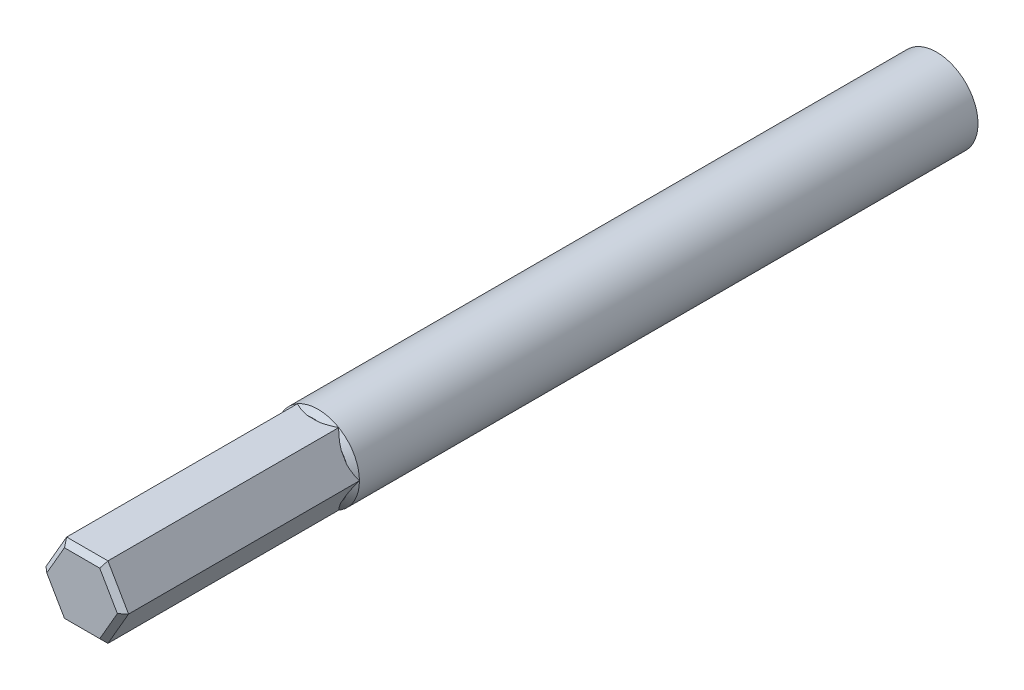
ISO-10303-21;
HEADER;
FILE_DESCRIPTION(('STEP AP214'),'2;1');
FILE_NAME('part.step','',(''),(''),'','','');
FILE_SCHEMA(('AUTOMOTIVE_DESIGN { 1 0 10303 214 1 1 1 1 }'));
ENDSEC;
DATA;
#1=APPLICATION_CONTEXT('core data for automotive mechanical design processes');
#2=APPLICATION_PROTOCOL_DEFINITION('international standard','automotive_design',2000,#1);
#3=PRODUCT_CONTEXT('',#1,'mechanical');
#4=PRODUCT('Part','Part','',(#3));
#5=PRODUCT_RELATED_PRODUCT_CATEGORY('part','',(#4));
#6=PRODUCT_DEFINITION_FORMATION('','',#4);
#7=PRODUCT_DEFINITION_CONTEXT('part definition',#1,'design');
#8=PRODUCT_DEFINITION('design','',#6,#7);
#9=PRODUCT_DEFINITION_SHAPE('','',#8);
#10=(LENGTH_UNIT() NAMED_UNIT(*) SI_UNIT(.MILLI.,.METRE.));
#11=(NAMED_UNIT(*) PLANE_ANGLE_UNIT() SI_UNIT($,.RADIAN.));
#12=(NAMED_UNIT(*) SI_UNIT($,.STERADIAN.) SOLID_ANGLE_UNIT());
#13=UNCERTAINTY_MEASURE_WITH_UNIT(LENGTH_MEASURE(1.E-05),#10,'distance_accuracy_value','');
#14=(GEOMETRIC_REPRESENTATION_CONTEXT(3) GLOBAL_UNCERTAINTY_ASSIGNED_CONTEXT((#13)) GLOBAL_UNIT_ASSIGNED_CONTEXT((#10,
#11,#12)) REPRESENTATION_CONTEXT('',''));
#15=CARTESIAN_POINT('',(0.,0.,0.));
#16=DIRECTION('',(0.,0.,1.));
#17=DIRECTION('',(1.,0.,0.));
#18=AXIS2_PLACEMENT_3D('',#15,#16,#17);
#19=CARTESIAN_POINT('',(0.,0.,60.));
#20=DIRECTION('',(0.,0.,1.));
#21=DIRECTION('',(1.,0.,0.));
#22=AXIS2_PLACEMENT_3D('',#19,#20,#21);
#23=PLANE('',#22);
#24=DIRECTION('',(0.5,-0.866025403784438,0.));
#25=VECTOR('',#24,1.);
#26=CARTESIAN_POINT('',(-3.97113248654052,0.,60.));
#27=LINE('',#26,#25);
#28=CARTESIAN_POINT('',(-3.22745028860742,-1.28809535150462,60.));
#29=VERTEX_POINT('',#28);
#30=CARTESIAN_POINT('',(-2.72924844120336,-2.15100626363313,60.));
#31=VERTEX_POINT('',#30);
#32=EDGE_CURVE('E272',#29,#31,#27,.T.);
#33=ORIENTED_EDGE('',*,*,#32,.F.);
#34=CARTESIAN_POINT('',(0.,0.,60.));
#35=DIRECTION('',(0.,0.,1.));
#36=DIRECTION('',(1.,0.,0.));
#37=AXIS2_PLACEMENT_3D('',#34,#35,#36);
#38=CIRCLE('',#37,3.47499999999999);
#39=EDGE_CURVE('E198',#29,#31,#38,.T.);
#40=ORIENTED_EDGE('',*,*,#39,.T.);
#41=EDGE_LOOP('',(#33,#40));
#42=FACE_BOUND('',#41,.T.);
#43=ADVANCED_FACE('F36',(#42),#23,.T.);
#44=DIRECTION('',(1.,0.,0.));
#45=VECTOR('',#44,1.);
#46=CARTESIAN_POINT('',(-1.98556624327026,-3.43910161513776,60.));
#47=LINE('',#46,#45);
#48=CARTESIAN_POINT('',(-0.498201847404044,-3.43910161513776,60.));
#49=VERTEX_POINT('',#48);
#50=CARTESIAN_POINT('',(0.498201847404045,-3.43910161513776,60.));
#51=VERTEX_POINT('',#50);
#52=EDGE_CURVE('E275',#49,#51,#47,.T.);
#53=ORIENTED_EDGE('',*,*,#52,.F.);
#54=CARTESIAN_POINT('',(0.,0.,60.));
#55=DIRECTION('',(0.,0.,1.));
#56=DIRECTION('',(1.,0.,0.));
#57=AXIS2_PLACEMENT_3D('',#54,#55,#56);
#58=CIRCLE('',#57,3.47499999999999);
#59=EDGE_CURVE('E196',#49,#51,#58,.T.);
#60=ORIENTED_EDGE('',*,*,#59,.T.);
#61=EDGE_LOOP('',(#53,#60));
#62=FACE_BOUND('',#61,.T.);
#63=ADVANCED_FACE('F385',(#62),#23,.T.);
#64=DIRECTION('',(0.499999999999999,0.866025403784439,0.));
#65=VECTOR('',#64,1.);
#66=CARTESIAN_POINT('',(1.98556624327026,-3.43910161513776,60.));
#67=LINE('',#66,#65);
#68=CARTESIAN_POINT('',(2.72924844120336,-2.15100626363313,60.));
#69=VERTEX_POINT('',#68);
#70=CARTESIAN_POINT('',(3.22745028860742,-1.28809535150462,60.));
#71=VERTEX_POINT('',#70);
#72=EDGE_CURVE('E251',#69,#71,#67,.T.);
#73=ORIENTED_EDGE('',*,*,#72,.F.);
#74=CARTESIAN_POINT('',(0.,0.,60.));
#75=DIRECTION('',(0.,0.,1.));
#76=DIRECTION('',(1.,0.,0.));
#77=AXIS2_PLACEMENT_3D('',#74,#75,#76);
#78=CIRCLE('',#77,3.47499999999999);
#79=EDGE_CURVE('E194',#69,#71,#78,.T.);
#80=ORIENTED_EDGE('',*,*,#79,.T.);
#81=EDGE_LOOP('',(#73,#80));
#82=FACE_BOUND('',#81,.T.);
#83=ADVANCED_FACE('F390',(#82),#23,.T.);
#84=DIRECTION('',(-0.5,0.866025403784438,0.));
#85=VECTOR('',#84,1.);
#86=CARTESIAN_POINT('',(3.97113248654052,0.,60.));
#87=LINE('',#86,#85);
#88=CARTESIAN_POINT('',(3.22745028860741,1.28809535150463,60.));
#89=VERTEX_POINT('',#88);
#90=CARTESIAN_POINT('',(2.72924844120337,2.15100626363312,60.));
#91=VERTEX_POINT('',#90);
#92=EDGE_CURVE('E257',#89,#91,#87,.T.);
#93=ORIENTED_EDGE('',*,*,#92,.F.);
#94=CARTESIAN_POINT('',(0.,0.,60.));
#95=DIRECTION('',(0.,0.,1.));
#96=DIRECTION('',(1.,0.,0.));
#97=AXIS2_PLACEMENT_3D('',#94,#95,#96);
#98=CIRCLE('',#97,3.47499999999999);
#99=EDGE_CURVE('E192',#89,#91,#98,.T.);
#100=ORIENTED_EDGE('',*,*,#99,.T.);
#101=EDGE_LOOP('',(#93,#100));
#102=FACE_BOUND('',#101,.T.);
#103=ADVANCED_FACE('F450',(#102),#23,.T.);
#104=DIRECTION('',(-1.,0.,0.));
#105=VECTOR('',#104,1.);
#106=CARTESIAN_POINT('',(1.98556624327026,3.43910161513776,60.));
#107=LINE('',#106,#105);
#108=CARTESIAN_POINT('',(0.498201847404051,3.43910161513776,60.));
#109=VERTEX_POINT('',#108);
#110=CARTESIAN_POINT('',(-0.498201847404052,3.43910161513776,60.));
#111=VERTEX_POINT('',#110);
#112=EDGE_CURVE('E264',#109,#111,#107,.T.);
#113=ORIENTED_EDGE('',*,*,#112,.F.);
#114=CARTESIAN_POINT('',(0.,0.,60.));
#115=DIRECTION('',(0.,0.,1.));
#116=DIRECTION('',(1.,0.,0.));
#117=AXIS2_PLACEMENT_3D('',#114,#115,#116);
#118=CIRCLE('',#117,3.47499999999999);
#119=EDGE_CURVE('E190',#109,#111,#118,.T.);
#120=ORIENTED_EDGE('',*,*,#119,.T.);
#121=EDGE_LOOP('',(#113,#120));
#122=FACE_BOUND('',#121,.T.);
#123=ADVANCED_FACE('F343',(#122),#23,.T.);
#124=CARTESIAN_POINT('',(0.,0.,60.));
#125=DIRECTION('',(0.,0.,-1.));
#126=DIRECTION('',(-1.,0.,0.));
#127=AXIS2_PLACEMENT_3D('',#124,#125,#126);
#128=CYLINDRICAL_SURFACE('',#127,3.975);
#129=CARTESIAN_POINT('',(0.,0.,59.5));
#130=DIRECTION('',(0.,0.,1.));
#131=DIRECTION('',(1.,0.,0.));
#132=AXIS2_PLACEMENT_3D('',#129,#130,#131);
#133=CIRCLE('',#132,3.975);
#134=CARTESIAN_POINT('',(3.975,0.,59.5));
#135=VERTEX_POINT('',#134);
#136=EDGE_CURVE('E201',#135,#135,#133,.F.);
#137=ORIENTED_EDGE('',*,*,#136,.T.);
#138=EDGE_LOOP('',(#137));
#139=FACE_BOUND('',#138,.T.);
#140=CARTESIAN_POINT('',(0.,0.,0.));
#141=DIRECTION('',(0.,0.,1.));
#142=DIRECTION('',(1.,0.,0.));
#143=AXIS2_PLACEMENT_3D('',#140,#141,#142);
#144=CIRCLE('',#143,3.975);
#145=CARTESIAN_POINT('',(3.975,0.,0.));
#146=VERTEX_POINT('',#145);
#147=EDGE_CURVE('E166',#146,#146,#144,.T.);
#148=ORIENTED_EDGE('',*,*,#147,.T.);
#149=EDGE_LOOP('',(#148));
#150=FACE_BOUND('',#149,.T.);
#151=ADVANCED_FACE('F341',(#139,#150),#128,.T.);
#152=DIRECTION('',(-0.5,-0.866025403784439,0.));
#153=VECTOR('',#152,1.);
#154=CARTESIAN_POINT('',(-1.98556624327026,3.43910161513776,60.));
#155=LINE('',#154,#153);
#156=CARTESIAN_POINT('',(-2.72924844120336,2.15100626363313,60.));
#157=VERTEX_POINT('',#156);
#158=CARTESIAN_POINT('',(-3.22745028860742,1.28809535150463,60.));
#159=VERTEX_POINT('',#158);
#160=EDGE_CURVE('E269',#157,#159,#155,.T.);
#161=ORIENTED_EDGE('',*,*,#160,.F.);
#162=CARTESIAN_POINT('',(0.,0.,60.));
#163=DIRECTION('',(0.,0.,1.));
#164=DIRECTION('',(1.,0.,0.));
#165=AXIS2_PLACEMENT_3D('',#162,#163,#164);
#166=CIRCLE('',#165,3.47499999999999);
#167=EDGE_CURVE('E188',#157,#159,#166,.T.);
#168=ORIENTED_EDGE('',*,*,#167,.T.);
#169=EDGE_LOOP('',(#161,#168));
#170=FACE_BOUND('',#169,.T.);
#171=ADVANCED_FACE('F337',(#170),#23,.T.);
#172=CARTESIAN_POINT('',(0.,0.,0.));
#173=DIRECTION('',(0.,0.,1.));
#174=DIRECTION('',(1.,0.,0.));
#175=AXIS2_PLACEMENT_3D('',#172,#173,#174);
#176=PLANE('',#175);
#177=ORIENTED_EDGE('',*,*,#147,.F.);
#178=EDGE_LOOP('',(#177));
#179=FACE_BOUND('',#178,.T.);
#180=ADVANCED_FACE('F335',(#179),#176,.F.);
#181=CARTESIAN_POINT('',(1.98556624327026,-3.43910161513776,82.2));
#182=DIRECTION('',(-0.866025403784439,0.499999999999999,0.));
#183=DIRECTION('',(-0.5,-0.866025403784439,0.));
#184=AXIS2_PLACEMENT_3D('',#181,#182,#183);
#185=PLANE('',#184);
#186=DIRECTION('',(0.,0.,-1.));
#187=VECTOR('',#186,1.);
#188=CARTESIAN_POINT('',(3.97113248654052,0.,82.2));
#189=LINE('',#188,#187);
#190=CARTESIAN_POINT('',(3.97113248654052,0.,81.7));
#191=VERTEX_POINT('',#190);
#192=CARTESIAN_POINT('',(3.97113248654052,0.,59.5038675134595));
#193=VERTEX_POINT('',#192);
#194=EDGE_CURVE('E286',#191,#193,#189,.T.);
#195=ORIENTED_EDGE('',*,*,#194,.F.);
#196=DIRECTION('',(-0.5,-0.866025403784439,0.));
#197=VECTOR('',#196,1.);
#198=CARTESIAN_POINT('',(1.98556624327026,-3.43910161513776,81.7));
#199=LINE('',#198,#197);
#200=CARTESIAN_POINT('',(1.98556624327026,-3.43910161513776,81.7));
#201=VERTEX_POINT('',#200);
#202=EDGE_CURVE('E186',#191,#201,#199,.T.);
#203=ORIENTED_EDGE('',*,*,#202,.T.);
#204=DIRECTION('',(0.,0.,-1.));
#205=VECTOR('',#204,1.);
#206=CARTESIAN_POINT('',(1.98556624327026,-3.43910161513776,82.2));
#207=LINE('',#206,#205);
#208=CARTESIAN_POINT('',(1.98556624327026,-3.43910161513776,59.5038675134595));
#209=VERTEX_POINT('',#208);
#210=EDGE_CURVE('E278',#201,#209,#207,.T.);
#211=ORIENTED_EDGE('',*,*,#210,.T.);
#212=CARTESIAN_POINT('',(1.98556624327026,-3.43910161513776,59.5038675134595));
#213=CARTESIAN_POINT('',(2.04437352425797,-3.33724441661207,59.5626293789472));
#214=CARTESIAN_POINT('',(2.10399820507765,-3.23397144004731,59.6183790047774));
#215=CARTESIAN_POINT('',(2.2245573192508,-3.02515692898392,59.7215565013533));
#216=CARTESIAN_POINT('',(2.2854808833814,-2.91963422053153,59.7690355113172));
#217=CARTESIAN_POINT('',(2.4091563335991,-2.70542205710552,59.8542410156271));
#218=CARTESIAN_POINT('',(2.47191075077807,-2.59672821815217,59.8919532203864));
#219=CARTESIAN_POINT('',(2.56736516891616,-2.43139631613007,59.939576817));
#220=CARTESIAN_POINT('',(2.5995103766895,-2.37571918304678,59.9539926743838));
#221=CARTESIAN_POINT('',(2.66414080299297,-2.26377600097435,59.9795310522561));
#222=CARTESIAN_POINT('',(2.69662617279967,-2.20750968996647,59.9906520369232));
#223=CARTESIAN_POINT('',(2.72924844120336,-2.15100626363313,60.));
#224=B_SPLINE_CURVE_WITH_KNOTS('',3,(#212,#213,#214,#215,#216,#217,#218,#219,#220,#221,#222,
#223),.UNSPECIFIED.,.F.,.F.,(4,2,2,2,2,4),(0.,0.394554806860656,0.786575983113884,
1.17916751696847,1.37675125324087,1.57442694380137),.UNSPECIFIED.);
#225=EDGE_CURVE('E310',#209,#69,#224,.T.);
#226=ORIENTED_EDGE('',*,*,#225,.T.);
#227=ORIENTED_EDGE('',*,*,#72,.T.);
#228=CARTESIAN_POINT('',(3.22745028860742,-1.28809535150462,60.));
#229=CARTESIAN_POINT('',(3.26007255701111,-1.23159192517128,59.9906520369232));
#230=CARTESIAN_POINT('',(3.29255792681782,-1.1753256141634,59.9795310522561));
#231=CARTESIAN_POINT('',(3.35718835312128,-1.06338243209097,59.9539926743838));
#232=CARTESIAN_POINT('',(3.38933356089462,-1.00770529900769,59.939576817));
#233=CARTESIAN_POINT('',(3.48478797903272,-0.84237339698558,59.8919532203864));
#234=CARTESIAN_POINT('',(3.54754239621168,-0.733679558032235,59.8542410156271));
#235=CARTESIAN_POINT('',(3.67121784642938,-0.519467394606224,59.7690355113172));
#236=CARTESIAN_POINT('',(3.73214141055999,-0.413944686153839,59.7215565013533));
#237=CARTESIAN_POINT('',(3.85270052473314,-0.205130175090445,59.6183790047774));
#238=CARTESIAN_POINT('',(3.91232520555282,-0.101857198525683,59.5626293789472));
#239=CARTESIAN_POINT('',(3.97113248654052,0.,59.5038675134595));
#240=B_SPLINE_CURVE_WITH_KNOTS('',3,(#228,#229,#230,#231,#232,#233,#234,#235,#236,#237,#238,
#239),.UNSPECIFIED.,.F.,.F.,(4,2,2,2,2,4),(0.,0.197675690560496,0.395259426832901,
0.787850960687484,1.17987213694071,1.57442694380136),.UNSPECIFIED.);
#241=EDGE_CURVE('E312',#71,#193,#240,.T.);
#242=ORIENTED_EDGE('',*,*,#241,.T.);
#243=EDGE_LOOP('',(#195,#203,#211,#226,#227,#242));
#244=FACE_BOUND('',#243,.T.);
#245=ADVANCED_FACE('F329',(#244),#185,.F.);
#246=CARTESIAN_POINT('',(3.97113248654052,0.,82.2));
#247=DIRECTION('',(-0.866025403784439,-0.5,0.));
#248=DIRECTION('',(0.5,-0.866025403784439,0.));
#249=AXIS2_PLACEMENT_3D('',#246,#247,#248);
#250=PLANE('',#249);
#251=DIRECTION('',(0.,0.,-1.));
#252=VECTOR('',#251,1.);
#253=CARTESIAN_POINT('',(1.98556624327026,3.43910161513776,82.2));
#254=LINE('',#253,#252);
#255=CARTESIAN_POINT('',(1.98556624327026,3.43910161513776,81.7));
#256=VERTEX_POINT('',#255);
#257=CARTESIAN_POINT('',(1.98556624327026,3.43910161513776,59.5038675134595));
#258=VERTEX_POINT('',#257);
#259=EDGE_CURVE('E284',#256,#258,#254,.T.);
#260=ORIENTED_EDGE('',*,*,#259,.F.);
#261=DIRECTION('',(0.5,-0.866025403784439,0.));
#262=VECTOR('',#261,1.);
#263=CARTESIAN_POINT('',(3.97113248654052,0.,81.7));
#264=LINE('',#263,#262);
#265=EDGE_CURVE('E184',#256,#191,#264,.T.);
#266=ORIENTED_EDGE('',*,*,#265,.T.);
#267=ORIENTED_EDGE('',*,*,#194,.T.);
#268=CARTESIAN_POINT('',(3.97113248654052,0.,59.5038675134595));
#269=CARTESIAN_POINT('',(3.91232520555282,0.101857198525688,59.5626293789472));
#270=CARTESIAN_POINT('',(3.85270052473314,0.205130175090451,59.6183790047774));
#271=CARTESIAN_POINT('',(3.73214141055998,0.413944686153846,59.7215565013533));
#272=CARTESIAN_POINT('',(3.67121784642938,0.519467394606231,59.7690355113172));
#273=CARTESIAN_POINT('',(3.54754239621168,0.733679558032244,59.8542410156271));
#274=CARTESIAN_POINT('',(3.48478797903271,0.842373396985589,59.8919532203864));
#275=CARTESIAN_POINT('',(3.38933356089462,1.0077052990077,59.939576817));
#276=CARTESIAN_POINT('',(3.35718835312127,1.06338243209098,59.9539926743838));
#277=CARTESIAN_POINT('',(3.29255792681781,1.17532561416341,59.9795310522561));
#278=CARTESIAN_POINT('',(3.26007255701111,1.23159192517129,59.9906520369232));
#279=CARTESIAN_POINT('',(3.22745028860742,1.28809535150464,60.));
#280=B_SPLINE_CURVE_WITH_KNOTS('',3,(#268,#269,#270,#271,#272,#273,#274,#275,#276,#277,#278,
#279),.UNSPECIFIED.,.F.,.F.,(4,2,2,2,2,4),(0.,0.394554806860654,0.786575983113884,
1.17916751696847,1.37675125324088,1.57442694380137),.UNSPECIFIED.);
#281=EDGE_CURVE('E432',#193,#89,#280,.T.);
#282=ORIENTED_EDGE('',*,*,#281,.T.);
#283=ORIENTED_EDGE('',*,*,#92,.T.);
#284=CARTESIAN_POINT('',(2.72924844120337,2.15100626363312,60.));
#285=CARTESIAN_POINT('',(2.69662617279968,2.20750968996647,59.9906520369232));
#286=CARTESIAN_POINT('',(2.66414080299297,2.26377600097435,59.9795310522561));
#287=CARTESIAN_POINT('',(2.59951037668951,2.37571918304678,59.9539926743838));
#288=CARTESIAN_POINT('',(2.56736516891617,2.43139631613006,59.939576817));
#289=CARTESIAN_POINT('',(2.47191075077807,2.59672821815217,59.8919532203864));
#290=CARTESIAN_POINT('',(2.4091563335991,2.70542205710552,59.8542410156271));
#291=CARTESIAN_POINT('',(2.2854808833814,2.91963422053153,59.7690355113172));
#292=CARTESIAN_POINT('',(2.2245573192508,3.02515692898392,59.7215565013533));
#293=CARTESIAN_POINT('',(2.10399820507764,3.23397144004731,59.6183790047774));
#294=CARTESIAN_POINT('',(2.04437352425797,3.33724441661207,59.5626293789472));
#295=CARTESIAN_POINT('',(1.98556624327026,3.43910161513776,59.5038675134595));
#296=B_SPLINE_CURVE_WITH_KNOTS('',3,(#284,#285,#286,#287,#288,#289,#290,#291,#292,#293,#294,
#295),.UNSPECIFIED.,.F.,.F.,(4,2,2,2,2,4),(0.,0.197675690560497,0.395259426832904,
0.78785096068749,1.17987213694072,1.57442694380138),.UNSPECIFIED.);
#297=EDGE_CURVE('E436',#91,#258,#296,.T.);
#298=ORIENTED_EDGE('',*,*,#297,.T.);
#299=EDGE_LOOP('',(#260,#266,#267,#282,#283,#298));
#300=FACE_BOUND('',#299,.T.);
#301=ADVANCED_FACE('F334',(#300),#250,.F.);
#302=CARTESIAN_POINT('',(1.98556624327026,3.43910161513776,82.2));
#303=DIRECTION('',(0.,-1.,0.));
#304=DIRECTION('',(1.,0.,0.));
#305=AXIS2_PLACEMENT_3D('',#302,#303,#304);
#306=PLANE('',#305);
#307=DIRECTION('',(0.,0.,-1.));
#308=VECTOR('',#307,1.);
#309=CARTESIAN_POINT('',(-1.98556624327026,3.43910161513776,82.2));
#310=LINE('',#309,#308);
#311=CARTESIAN_POINT('',(-1.98556624327026,3.43910161513776,81.7));
#312=VERTEX_POINT('',#311);
#313=CARTESIAN_POINT('',(-1.98556624327026,3.43910161513776,59.5038675134595));
#314=VERTEX_POINT('',#313);
#315=EDGE_CURVE('E62',#312,#314,#310,.T.);
#316=ORIENTED_EDGE('',*,*,#315,.F.);
#317=DIRECTION('',(1.,0.,0.));
#318=VECTOR('',#317,1.);
#319=CARTESIAN_POINT('',(1.98556624327026,3.43910161513776,81.7));
#320=LINE('',#319,#318);
#321=EDGE_CURVE('E182',#312,#256,#320,.T.);
#322=ORIENTED_EDGE('',*,*,#321,.T.);
#323=ORIENTED_EDGE('',*,*,#259,.T.);
#324=CARTESIAN_POINT('',(1.98556624327026,3.43910161513776,59.5038675134595));
#325=CARTESIAN_POINT('',(1.86795168129485,3.43910161513776,59.5626293789472));
#326=CARTESIAN_POINT('',(1.74870231965549,3.43910161513776,59.6183790047774));
#327=CARTESIAN_POINT('',(1.50758409130919,3.43910161513776,59.7215565013533));
#328=CARTESIAN_POINT('',(1.38573696304798,3.43910161513776,59.7690355113172));
#329=CARTESIAN_POINT('',(1.13838606261258,3.43910161513776,59.8542410156271));
#330=CARTESIAN_POINT('',(1.01287722825465,3.43910161513776,59.8919532203864));
#331=CARTESIAN_POINT('',(0.821968391978454,3.43910161513776,59.939576817));
#332=CARTESIAN_POINT('',(0.75767797643177,3.43910161513776,59.9539926743838));
#333=CARTESIAN_POINT('',(0.628417123824849,3.43910161513776,59.9795310522561));
#334=CARTESIAN_POINT('',(0.563446384211434,3.43910161513776,59.9906520369232));
#335=CARTESIAN_POINT('',(0.498201847404052,3.43910161513776,60.));
#336=B_SPLINE_CURVE_WITH_KNOTS('',3,(#324,#325,#326,#327,#328,#329,#330,#331,#332,#333,#334,
#335),.UNSPECIFIED.,.F.,.F.,(4,2,2,2,2,4),(0.,0.394554806860654,0.786575983113885,
1.17916751696847,1.37675125324088,1.57442694380137),.UNSPECIFIED.);
#337=EDGE_CURVE('E399',#258,#109,#336,.T.);
#338=ORIENTED_EDGE('',*,*,#337,.T.);
#339=ORIENTED_EDGE('',*,*,#112,.T.);
#340=CARTESIAN_POINT('',(-0.498201847404052,3.43910161513776,60.));
#341=CARTESIAN_POINT('',(-0.563446384211434,3.43910161513776,59.9906520369232));
#342=CARTESIAN_POINT('',(-0.628417123824849,3.43910161513776,59.9795310522561));
#343=CARTESIAN_POINT('',(-0.75767797643177,3.43910161513776,59.9539926743838));
#344=CARTESIAN_POINT('',(-0.821968391978454,3.43910161513776,59.939576817));
#345=CARTESIAN_POINT('',(-1.01287722825465,3.43910161513776,59.8919532203864));
#346=CARTESIAN_POINT('',(-1.13838606261258,3.43910161513776,59.8542410156271));
#347=CARTESIAN_POINT('',(-1.38573696304798,3.43910161513776,59.7690355113172));
#348=CARTESIAN_POINT('',(-1.50758409130919,3.43910161513776,59.7215565013533));
#349=CARTESIAN_POINT('',(-1.74870231965549,3.43910161513776,59.6183790047774));
#350=CARTESIAN_POINT('',(-1.86795168129485,3.43910161513776,59.5626293789472));
#351=CARTESIAN_POINT('',(-1.98556624327026,3.43910161513776,59.5038675134595));
#352=B_SPLINE_CURVE_WITH_KNOTS('',3,(#340,#341,#342,#343,#344,#345,#346,#347,#348,#349,#350,
#351),.UNSPECIFIED.,.F.,.F.,(4,2,2,2,2,4),(0.,0.197675690560497,0.395259426832903,
0.787850960687487,1.17987213694072,1.57442694380137),.UNSPECIFIED.);
#353=EDGE_CURVE('E397',#111,#314,#352,.T.);
#354=ORIENTED_EDGE('',*,*,#353,.T.);
#355=EDGE_LOOP('',(#316,#322,#323,#338,#339,#354));
#356=FACE_BOUND('',#355,.T.);
#357=ADVANCED_FACE('F415',(#356),#306,.F.);
#358=CARTESIAN_POINT('',(-1.98556624327026,3.43910161513776,82.2));
#359=DIRECTION('',(0.866025403784439,-0.5,0.));
#360=DIRECTION('',(0.5,0.866025403784439,0.));
#361=AXIS2_PLACEMENT_3D('',#358,#359,#360);
#362=PLANE('',#361);
#363=DIRECTION('',(0.,0.,-1.));
#364=VECTOR('',#363,1.);
#365=CARTESIAN_POINT('',(-3.97113248654052,0.,82.2));
#366=LINE('',#365,#364);
#367=CARTESIAN_POINT('',(-3.97113248654052,0.,81.7));
#368=VERTEX_POINT('',#367);
#369=CARTESIAN_POINT('',(-3.97113248654052,0.,59.5038675134595));
#370=VERTEX_POINT('',#369);
#371=EDGE_CURVE('E54',#368,#370,#366,.T.);
#372=ORIENTED_EDGE('',*,*,#371,.F.);
#373=DIRECTION('',(0.5,0.866025403784439,0.));
#374=VECTOR('',#373,1.);
#375=CARTESIAN_POINT('',(-1.98556624327026,3.43910161513776,81.7));
#376=LINE('',#375,#374);
#377=EDGE_CURVE('E180',#368,#312,#376,.T.);
#378=ORIENTED_EDGE('',*,*,#377,.T.);
#379=ORIENTED_EDGE('',*,*,#315,.T.);
#380=CARTESIAN_POINT('',(-1.98556624327026,3.43910161513776,59.5038675134595));
#381=CARTESIAN_POINT('',(-2.04437352425797,3.33724441661207,59.5626293789472));
#382=CARTESIAN_POINT('',(-2.10399820507765,3.23397144004731,59.6183790047774));
#383=CARTESIAN_POINT('',(-2.2245573192508,3.02515692898391,59.7215565013533));
#384=CARTESIAN_POINT('',(-2.2854808833814,2.91963422053153,59.7690355113172));
#385=CARTESIAN_POINT('',(-2.4091563335991,2.70542205710552,59.8542410156271));
#386=CARTESIAN_POINT('',(-2.47191075077807,2.59672821815217,59.8919532203864));
#387=CARTESIAN_POINT('',(-2.56736516891616,2.43139631613007,59.939576817));
#388=CARTESIAN_POINT('',(-2.5995103766895,2.37571918304678,59.9539926743838));
#389=CARTESIAN_POINT('',(-2.66414080299296,2.26377600097435,59.9795310522561));
#390=CARTESIAN_POINT('',(-2.69662617279967,2.20750968996647,59.9906520369232));
#391=CARTESIAN_POINT('',(-2.72924844120336,2.15100626363313,60.));
#392=B_SPLINE_CURVE_WITH_KNOTS('',3,(#380,#381,#382,#383,#384,#385,#386,#387,#388,#389,#390,
#391),.UNSPECIFIED.,.F.,.F.,(4,2,2,2,2,4),(0.,0.394554806860657,0.786575983113882,
1.17916751696846,1.37675125324087,1.57442694380137),.UNSPECIFIED.);
#393=EDGE_CURVE('E396',#314,#157,#392,.T.);
#394=ORIENTED_EDGE('',*,*,#393,.T.);
#395=ORIENTED_EDGE('',*,*,#160,.T.);
#396=CARTESIAN_POINT('',(-3.22745028860742,1.28809535150463,60.));
#397=CARTESIAN_POINT('',(-3.26007255701111,1.23159192517128,59.9906520369232));
#398=CARTESIAN_POINT('',(-3.29255792681782,1.1753256141634,59.9795310522561));
#399=CARTESIAN_POINT('',(-3.35718835312128,1.06338243209097,59.9539926743838));
#400=CARTESIAN_POINT('',(-3.38933356089462,1.00770529900769,59.939576817));
#401=CARTESIAN_POINT('',(-3.48478797903272,0.842373396985581,59.8919532203864));
#402=CARTESIAN_POINT('',(-3.54754239621168,0.733679558032236,59.8542410156271));
#403=CARTESIAN_POINT('',(-3.67121784642938,0.519467394606225,59.7690355113172));
#404=CARTESIAN_POINT('',(-3.73214141055999,0.41394468615384,59.7215565013533));
#405=CARTESIAN_POINT('',(-3.85270052473314,0.205130175090446,59.6183790047774));
#406=CARTESIAN_POINT('',(-3.91232520555281,0.101857198525684,59.5626293789472));
#407=CARTESIAN_POINT('',(-3.97113248654052,0.,59.5038675134595));
#408=B_SPLINE_CURVE_WITH_KNOTS('',3,(#396,#397,#398,#399,#400,#401,#402,#403,#404,#405,#406,
#407),.UNSPECIFIED.,.F.,.F.,(4,2,2,2,2,4),(0.,0.197675690560496,0.395259426832902,
0.787850960687484,1.17987213694071,1.57442694380136),.UNSPECIFIED.);
#409=EDGE_CURVE('E47',#159,#370,#408,.T.);
#410=ORIENTED_EDGE('',*,*,#409,.T.);
#411=EDGE_LOOP('',(#372,#378,#379,#394,#395,#410));
#412=FACE_BOUND('',#411,.T.);
#413=ADVANCED_FACE('F224',(#412),#362,.F.);
#414=CARTESIAN_POINT('',(-3.97113248654052,0.,82.2));
#415=DIRECTION('',(0.866025403784438,0.5,0.));
#416=DIRECTION('',(-0.5,0.866025403784438,0.));
#417=AXIS2_PLACEMENT_3D('',#414,#415,#416);
#418=PLANE('',#417);
#419=DIRECTION('',(0.,0.,-1.));
#420=VECTOR('',#419,1.);
#421=CARTESIAN_POINT('',(-1.98556624327026,-3.43910161513776,82.2));
#422=LINE('',#421,#420);
#423=CARTESIAN_POINT('',(-1.98556624327026,-3.43910161513776,81.7));
#424=VERTEX_POINT('',#423);
#425=CARTESIAN_POINT('',(-1.98556624327026,-3.43910161513776,59.5038675134595));
#426=VERTEX_POINT('',#425);
#427=EDGE_CURVE('E280',#424,#426,#422,.T.);
#428=ORIENTED_EDGE('',*,*,#427,.F.);
#429=DIRECTION('',(-0.5,0.866025403784438,0.));
#430=VECTOR('',#429,1.);
#431=CARTESIAN_POINT('',(-3.97113248654052,0.,81.7));
#432=LINE('',#431,#430);
#433=EDGE_CURVE('E173',#424,#368,#432,.T.);
#434=ORIENTED_EDGE('',*,*,#433,.T.);
#435=ORIENTED_EDGE('',*,*,#371,.T.);
#436=CARTESIAN_POINT('',(-3.97113248654052,0.,59.5038675134595));
#437=CARTESIAN_POINT('',(-3.91232520555281,-0.101857198525686,59.5626293789472));
#438=CARTESIAN_POINT('',(-3.85270052473314,-0.205130175090448,59.6183790047774));
#439=CARTESIAN_POINT('',(-3.73214141055999,-0.413944686153841,59.7215565013533));
#440=CARTESIAN_POINT('',(-3.67121784642938,-0.519467394606225,59.7690355113172));
#441=CARTESIAN_POINT('',(-3.54754239621168,-0.733679558032236,59.8542410156271));
#442=CARTESIAN_POINT('',(-3.48478797903272,-0.84237339698558,59.8919532203864));
#443=CARTESIAN_POINT('',(-3.38933356089462,-1.00770529900769,59.939576817));
#444=CARTESIAN_POINT('',(-3.35718835312128,-1.06338243209097,59.9539926743838));
#445=CARTESIAN_POINT('',(-3.29255792681782,-1.1753256141634,59.9795310522561));
#446=CARTESIAN_POINT('',(-3.26007255701111,-1.23159192517128,59.9906520369232));
#447=CARTESIAN_POINT('',(-3.22745028860742,-1.28809535150462,60.));
#448=B_SPLINE_CURVE_WITH_KNOTS('',3,(#436,#437,#438,#439,#440,#441,#442,#443,#444,#445,#446,
#447),.UNSPECIFIED.,.F.,.F.,(4,2,2,2,2,4),(0.,0.394554806860651,0.786575983113878,
1.17916751696846,1.37675125324087,1.57442694380136),.UNSPECIFIED.);
#449=EDGE_CURVE('E11',#370,#29,#448,.T.);
#450=ORIENTED_EDGE('',*,*,#449,.T.);
#451=ORIENTED_EDGE('',*,*,#32,.T.);
#452=CARTESIAN_POINT('',(-2.72924844120336,-2.15100626363313,60.));
#453=CARTESIAN_POINT('',(-2.69662617279967,-2.20750968996648,59.9906520369232));
#454=CARTESIAN_POINT('',(-2.66414080299296,-2.26377600097436,59.9795310522561));
#455=CARTESIAN_POINT('',(-2.5995103766895,-2.37571918304678,59.9539926743838));
#456=CARTESIAN_POINT('',(-2.56736516891616,-2.43139631613007,59.939576817));
#457=CARTESIAN_POINT('',(-2.47191075077806,-2.59672821815218,59.8919532203864));
#458=CARTESIAN_POINT('',(-2.40915633359909,-2.70542205710552,59.8542410156271));
#459=CARTESIAN_POINT('',(-2.2854808833814,-2.91963422053153,59.7690355113172));
#460=CARTESIAN_POINT('',(-2.22455731925079,-3.02515692898392,59.7215565013533));
#461=CARTESIAN_POINT('',(-2.10399820507764,-3.23397144004731,59.6183790047774));
#462=CARTESIAN_POINT('',(-2.04437352425796,-3.33724441661207,59.5626293789472));
#463=CARTESIAN_POINT('',(-1.98556624327026,-3.43910161513776,59.5038675134595));
#464=B_SPLINE_CURVE_WITH_KNOTS('',3,(#452,#453,#454,#455,#456,#457,#458,#459,#460,#461,#462,
#463),.UNSPECIFIED.,.F.,.F.,(4,2,2,2,2,4),(0.,0.197675690560495,0.395259426832901,
0.787850960687483,1.17987213694071,1.57442694380136),.UNSPECIFIED.);
#465=EDGE_CURVE('E204',#31,#426,#464,.T.);
#466=ORIENTED_EDGE('',*,*,#465,.T.);
#467=EDGE_LOOP('',(#428,#434,#435,#450,#451,#466));
#468=FACE_BOUND('',#467,.T.);
#469=ADVANCED_FACE('F219',(#468),#418,.F.);
#470=CARTESIAN_POINT('',(-1.98556624327026,-3.43910161513776,82.2));
#471=DIRECTION('',(0.,1.,0.));
#472=DIRECTION('',(-1.,0.,0.));
#473=AXIS2_PLACEMENT_3D('',#470,#471,#472);
#474=PLANE('',#473);
#475=ORIENTED_EDGE('',*,*,#210,.F.);
#476=DIRECTION('',(-1.,0.,0.));
#477=VECTOR('',#476,1.);
#478=CARTESIAN_POINT('',(-1.98556624327026,-3.43910161513776,81.7));
#479=LINE('',#478,#477);
#480=EDGE_CURVE('E153',#201,#424,#479,.T.);
#481=ORIENTED_EDGE('',*,*,#480,.T.);
#482=ORIENTED_EDGE('',*,*,#427,.T.);
#483=CARTESIAN_POINT('',(-1.98556624327026,-3.43910161513776,59.5038675134595));
#484=CARTESIAN_POINT('',(-1.86795168129485,-3.43910161513776,59.5626293789472));
#485=CARTESIAN_POINT('',(-1.74870231965549,-3.43910161513776,59.6183790047774));
#486=CARTESIAN_POINT('',(-1.50758409130918,-3.43910161513776,59.7215565013533));
#487=CARTESIAN_POINT('',(-1.38573696304798,-3.43910161513776,59.7690355113172));
#488=CARTESIAN_POINT('',(-1.13838606261258,-3.43910161513776,59.8542410156271));
#489=CARTESIAN_POINT('',(-1.01287722825464,-3.43910161513776,59.8919532203864));
#490=CARTESIAN_POINT('',(-0.821968391978448,-3.43910161513776,59.939576817));
#491=CARTESIAN_POINT('',(-0.757677976431763,-3.43910161513776,59.9539926743838));
#492=CARTESIAN_POINT('',(-0.628417123824842,-3.43910161513776,59.9795310522561));
#493=CARTESIAN_POINT('',(-0.563446384211427,-3.43910161513776,59.9906520369232));
#494=CARTESIAN_POINT('',(-0.498201847404044,-3.43910161513776,60.));
#495=B_SPLINE_CURVE_WITH_KNOTS('',3,(#483,#484,#485,#486,#487,#488,#489,#490,#491,#492,#493,
#494),.UNSPECIFIED.,.F.,.F.,(4,2,2,2,2,4),(0.,0.394554806860654,0.786575983113884,
1.17916751696847,1.37675125324088,1.57442694380137),.UNSPECIFIED.);
#496=EDGE_CURVE('E212',#426,#49,#495,.T.);
#497=ORIENTED_EDGE('',*,*,#496,.T.);
#498=ORIENTED_EDGE('',*,*,#52,.T.);
#499=CARTESIAN_POINT('',(0.498201847404045,-3.43910161513776,60.));
#500=CARTESIAN_POINT('',(0.563446384211428,-3.43910161513776,59.9906520369232));
#501=CARTESIAN_POINT('',(0.628417123824844,-3.43910161513776,59.9795310522561));
#502=CARTESIAN_POINT('',(0.757677976431765,-3.43910161513776,59.9539926743838));
#503=CARTESIAN_POINT('',(0.821968391978449,-3.43910161513776,59.939576817));
#504=CARTESIAN_POINT('',(1.01287722825464,-3.43910161513776,59.8919532203864));
#505=CARTESIAN_POINT('',(1.13838606261258,-3.43910161513776,59.8542410156271));
#506=CARTESIAN_POINT('',(1.38573696304798,-3.43910161513776,59.7690355113172));
#507=CARTESIAN_POINT('',(1.50758409130919,-3.43910161513776,59.7215565013533));
#508=CARTESIAN_POINT('',(1.74870231965549,-3.43910161513776,59.6183790047774));
#509=CARTESIAN_POINT('',(1.86795168129485,-3.43910161513776,59.5626293789472));
#510=CARTESIAN_POINT('',(1.98556624327026,-3.43910161513776,59.5038675134595));
#511=B_SPLINE_CURVE_WITH_KNOTS('',3,(#499,#500,#501,#502,#503,#504,#505,#506,#507,#508,#509,
#510),.UNSPECIFIED.,.F.,.F.,(4,2,2,2,2,4),(0.,0.197675690560498,0.395259426832905,
0.787850960687492,1.17987213694072,1.57442694380138),.UNSPECIFIED.);
#512=EDGE_CURVE('E309',#51,#209,#511,.T.);
#513=ORIENTED_EDGE('',*,*,#512,.T.);
#514=EDGE_LOOP('',(#475,#481,#482,#497,#498,#513));
#515=FACE_BOUND('',#514,.T.);
#516=ADVANCED_FACE('F223',(#515),#474,.F.);
#517=CARTESIAN_POINT('',(0.,0.,82.2));
#518=DIRECTION('',(0.,0.,1.));
#519=DIRECTION('',(1.,0.,0.));
#520=AXIS2_PLACEMENT_3D('',#517,#518,#519);
#521=PLANE('',#520);
#522=DIRECTION('',(0.5,-0.866025403784438,0.));
#523=VECTOR('',#522,1.);
#524=CARTESIAN_POINT('',(-1.55255354137804,-3.18910161513776,82.2));
#525=LINE('',#524,#523);
#526=CARTESIAN_POINT('',(-3.3937822173509,0.,82.2));
#527=VERTEX_POINT('',#526);
#528=CARTESIAN_POINT('',(-1.69689110867545,-2.93910161513776,82.2));
#529=VERTEX_POINT('',#528);
#530=EDGE_CURVE('E170',#527,#529,#525,.T.);
#531=ORIENTED_EDGE('',*,*,#530,.T.);
#532=DIRECTION('',(1.,0.,0.));
#533=VECTOR('',#532,1.);
#534=CARTESIAN_POINT('',(1.98556624327026,-2.93910161513776,82.2));
#535=LINE('',#534,#533);
#536=CARTESIAN_POINT('',(1.69689110867545,-2.93910161513776,82.2));
#537=VERTEX_POINT('',#536);
#538=EDGE_CURVE('E151',#529,#537,#535,.T.);
#539=ORIENTED_EDGE('',*,*,#538,.T.);
#540=DIRECTION('',(0.5,0.866025403784439,0.));
#541=VECTOR('',#540,1.);
#542=CARTESIAN_POINT('',(3.53811978464831,0.25,82.2));
#543=LINE('',#542,#541);
#544=CARTESIAN_POINT('',(3.3937822173509,0.,82.2));
#545=VERTEX_POINT('',#544);
#546=EDGE_CURVE('E159',#537,#545,#543,.T.);
#547=ORIENTED_EDGE('',*,*,#546,.T.);
#548=DIRECTION('',(-0.5,0.866025403784439,0.));
#549=VECTOR('',#548,1.);
#550=CARTESIAN_POINT('',(1.55255354137805,3.18910161513776,82.2));
#551=LINE('',#550,#549);
#552=CARTESIAN_POINT('',(1.69689110867545,2.93910161513776,82.2));
#553=VERTEX_POINT('',#552);
#554=EDGE_CURVE('E165',#545,#553,#551,.T.);
#555=ORIENTED_EDGE('',*,*,#554,.T.);
#556=DIRECTION('',(-1.,0.,0.));
#557=VECTOR('',#556,1.);
#558=CARTESIAN_POINT('',(-1.98556624327026,2.93910161513776,82.2));
#559=LINE('',#558,#557);
#560=CARTESIAN_POINT('',(-1.69689110867545,2.93910161513776,82.2));
#561=VERTEX_POINT('',#560);
#562=EDGE_CURVE('E291',#553,#561,#559,.T.);
#563=ORIENTED_EDGE('',*,*,#562,.T.);
#564=DIRECTION('',(-0.5,-0.866025403784439,0.));
#565=VECTOR('',#564,1.);
#566=CARTESIAN_POINT('',(-3.5381197846483,-0.249999999999999,82.2));
#567=LINE('',#566,#565);
#568=EDGE_CURVE('E175',#561,#527,#567,.T.);
#569=ORIENTED_EDGE('',*,*,#568,.T.);
#570=EDGE_LOOP('',(#531,#539,#547,#555,#563,#569));
#571=FACE_BOUND('',#570,.T.);
#572=ADVANCED_FACE('F168',(#571),#521,.T.);
#573=CARTESIAN_POINT('',(0.,2.93910161513776,82.2));
#574=DIRECTION('',(0.,0.70710678118655,0.707106781186545));
#575=DIRECTION('',(1.,0.,0.));
#576=AXIS2_PLACEMENT_3D('',#573,#574,#575);
#577=PLANE('',#576);
#578=DIRECTION('',(-0.377964473009225,-0.654653670707975,0.65465367070798));
#579=VECTOR('',#578,1.);
#580=CARTESIAN_POINT('',(1.45447809315039,2.51922995583237,82.6198716593054));
#581=LINE('',#580,#579);
#582=EDGE_CURVE('E245',#256,#553,#581,.T.);
#583=ORIENTED_EDGE('',*,*,#582,.F.);
#584=ORIENTED_EDGE('',*,*,#321,.F.);
#585=DIRECTION('',(0.377964473009225,-0.654653670707976,0.65465367070798));
#586=VECTOR('',#585,1.);
#587=CARTESIAN_POINT('',(-1.45447809315039,2.51922995583237,82.6198716593054));
#588=LINE('',#587,#586);
#589=EDGE_CURVE('E42',#561,#312,#588,.F.);
#590=ORIENTED_EDGE('',*,*,#589,.F.);
#591=ORIENTED_EDGE('',*,*,#562,.F.);
#592=EDGE_LOOP('',(#583,#584,#590,#591));
#593=FACE_BOUND('',#592,.T.);
#594=ADVANCED_FACE('F376',(#593),#577,.T.);
#595=CARTESIAN_POINT('',(-2.54533666301318,1.46955080756888,82.2));
#596=DIRECTION('',(-0.612372435695798,0.353553390593275,0.707106781186544));
#597=DIRECTION('',(0.5,0.866025403784439,0.));
#598=AXIS2_PLACEMENT_3D('',#595,#596,#597);
#599=PLANE('',#598);
#600=ORIENTED_EDGE('',*,*,#589,.T.);
#601=ORIENTED_EDGE('',*,*,#377,.F.);
#602=DIRECTION('',(0.755928946018451,0.,0.654653670707981));
#603=VECTOR('',#602,1.);
#604=CARTESIAN_POINT('',(-2.90895618630078,0.,82.6198716593054));
#605=LINE('',#604,#603);
#606=EDGE_CURVE('E243',#527,#368,#605,.F.);
#607=ORIENTED_EDGE('',*,*,#606,.F.);
#608=ORIENTED_EDGE('',*,*,#568,.F.);
#609=EDGE_LOOP('',(#600,#601,#607,#608));
#610=FACE_BOUND('',#609,.T.);
#611=ADVANCED_FACE('F294',(#610),#599,.T.);
#612=CARTESIAN_POINT('',(2.54533666301318,1.46955080756888,82.2));
#613=DIRECTION('',(0.612372435695797,0.353553390593275,0.707106781186544));
#614=DIRECTION('',(0.5,-0.866025403784439,0.));
#615=AXIS2_PLACEMENT_3D('',#612,#613,#614);
#616=PLANE('',#615);
#617=ORIENTED_EDGE('',*,*,#582,.T.);
#618=ORIENTED_EDGE('',*,*,#554,.F.);
#619=DIRECTION('',(-0.755928946018451,0.,0.654653670707981));
#620=VECTOR('',#619,1.);
#621=CARTESIAN_POINT('',(2.90895618630078,0.,82.6198716593054));
#622=LINE('',#621,#620);
#623=EDGE_CURVE('E162',#191,#545,#622,.T.);
#624=ORIENTED_EDGE('',*,*,#623,.F.);
#625=ORIENTED_EDGE('',*,*,#265,.F.);
#626=EDGE_LOOP('',(#617,#618,#624,#625));
#627=FACE_BOUND('',#626,.T.);
#628=ADVANCED_FACE('F366',(#627),#616,.T.);
#629=CARTESIAN_POINT('',(-2.54533666301317,-1.46955080756888,82.2));
#630=DIRECTION('',(-0.612372435695797,-0.353553390593276,0.707106781186544));
#631=DIRECTION('',(-0.5,0.866025403784438,0.));
#632=AXIS2_PLACEMENT_3D('',#629,#630,#631);
#633=PLANE('',#632);
#634=ORIENTED_EDGE('',*,*,#606,.T.);
#635=ORIENTED_EDGE('',*,*,#433,.F.);
#636=DIRECTION('',(0.377964473009225,0.654653670707975,0.654653670707981));
#637=VECTOR('',#636,1.);
#638=CARTESIAN_POINT('',(-1.45447809315039,-2.51922995583237,82.6198716593054));
#639=LINE('',#638,#637);
#640=EDGE_CURVE('E156',#529,#424,#639,.F.);
#641=ORIENTED_EDGE('',*,*,#640,.F.);
#642=ORIENTED_EDGE('',*,*,#530,.F.);
#643=EDGE_LOOP('',(#634,#635,#641,#642));
#644=FACE_BOUND('',#643,.T.);
#645=ADVANCED_FACE('F297',(#644),#633,.T.);
#646=CARTESIAN_POINT('',(2.54533666301318,-1.46955080756888,82.2));
#647=DIRECTION('',(0.612372435695798,-0.353553390593275,0.707106781186544));
#648=DIRECTION('',(-0.5,-0.866025403784439,0.));
#649=AXIS2_PLACEMENT_3D('',#646,#647,#648);
#650=PLANE('',#649);
#651=ORIENTED_EDGE('',*,*,#623,.T.);
#652=ORIENTED_EDGE('',*,*,#546,.F.);
#653=DIRECTION('',(0.377964473009225,-0.654653670707975,-0.654653670707981));
#654=VECTOR('',#653,1.);
#655=CARTESIAN_POINT('',(1.45447809315039,-2.51922995583237,82.6198716593054));
#656=LINE('',#655,#654);
#657=EDGE_CURVE('E147',#201,#537,#656,.F.);
#658=ORIENTED_EDGE('',*,*,#657,.F.);
#659=ORIENTED_EDGE('',*,*,#202,.F.);
#660=EDGE_LOOP('',(#651,#652,#658,#659));
#661=FACE_BOUND('',#660,.T.);
#662=ADVANCED_FACE('F160',(#661),#650,.T.);
#663=CARTESIAN_POINT('',(0.,-2.93910161513776,82.2));
#664=DIRECTION('',(0.,-0.707106781186551,0.707106781186544));
#665=DIRECTION('',(-1.,0.,0.));
#666=AXIS2_PLACEMENT_3D('',#663,#664,#665);
#667=PLANE('',#666);
#668=ORIENTED_EDGE('',*,*,#640,.T.);
#669=ORIENTED_EDGE('',*,*,#480,.F.);
#670=ORIENTED_EDGE('',*,*,#657,.T.);
#671=ORIENTED_EDGE('',*,*,#538,.F.);
#672=EDGE_LOOP('',(#668,#669,#670,#671));
#673=FACE_BOUND('',#672,.T.);
#674=ADVANCED_FACE('F149',(#673),#667,.T.);
#675=CARTESIAN_POINT('',(0.,0.,60.));
#676=DIRECTION('',(0.,0.,-1.));
#677=DIRECTION('',(-1.,0.,0.));
#678=AXIS2_PLACEMENT_3D('',#675,#676,#677);
#679=CONICAL_SURFACE('',#678,3.47499999999999,0.785398163397457);
#680=ORIENTED_EDGE('',*,*,#136,.F.);
#681=EDGE_LOOP('',(#680));
#682=FACE_BOUND('',#681,.T.);
#683=ORIENTED_EDGE('',*,*,#465,.F.);
#684=ORIENTED_EDGE('',*,*,#39,.F.);
#685=ORIENTED_EDGE('',*,*,#449,.F.);
#686=ORIENTED_EDGE('',*,*,#409,.F.);
#687=ORIENTED_EDGE('',*,*,#167,.F.);
#688=ORIENTED_EDGE('',*,*,#393,.F.);
#689=ORIENTED_EDGE('',*,*,#353,.F.);
#690=ORIENTED_EDGE('',*,*,#119,.F.);
#691=ORIENTED_EDGE('',*,*,#337,.F.);
#692=ORIENTED_EDGE('',*,*,#297,.F.);
#693=ORIENTED_EDGE('',*,*,#99,.F.);
#694=ORIENTED_EDGE('',*,*,#281,.F.);
#695=ORIENTED_EDGE('',*,*,#241,.F.);
#696=ORIENTED_EDGE('',*,*,#79,.F.);
#697=ORIENTED_EDGE('',*,*,#225,.F.);
#698=ORIENTED_EDGE('',*,*,#512,.F.);
#699=ORIENTED_EDGE('',*,*,#59,.F.);
#700=ORIENTED_EDGE('',*,*,#496,.F.);
#701=EDGE_LOOP('',(#683,#684,#685,#686,#687,#688,#689,#690,#691,#692,#693,#694,#695,#696,#697,
#698,#699,#700));
#702=FACE_BOUND('',#701,.T.);
#703=ADVANCED_FACE('F39',(#682,#702),#679,.T.);
#704=CLOSED_SHELL('',(#43,#63,#83,#103,#123,#151,#171,#180,#245,#301,#357,#413,#469,#516,#572,
#594,#611,#628,#645,#662,#674,#703));
#705=MANIFOLD_SOLID_BREP('B2',#704);
#706=ADVANCED_BREP_SHAPE_REPRESENTATION('',(#18,#705),#14);
#707=SHAPE_DEFINITION_REPRESENTATION(#9,#706);
ENDSEC;
END-ISO-10303-21;
